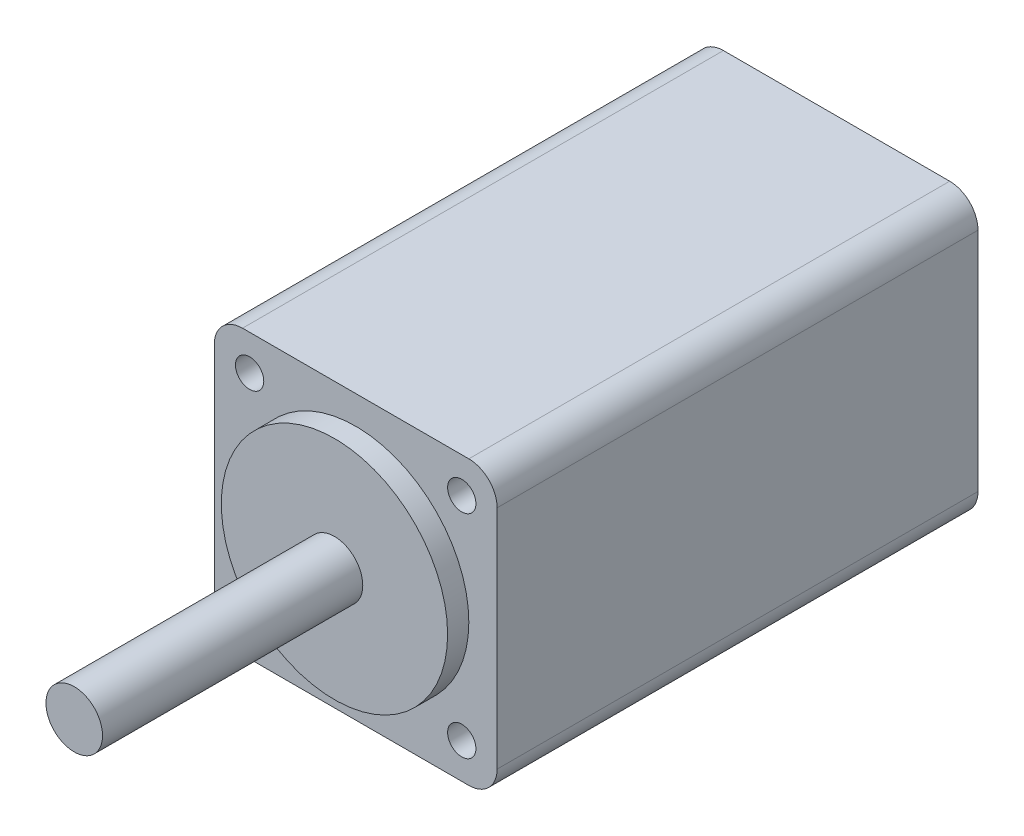
ISO-10303-21;
HEADER;
FILE_DESCRIPTION(('STEP AP214'),'2;1');
FILE_NAME('part.step','',(''),(''),'','','');
FILE_SCHEMA(('AUTOMOTIVE_DESIGN { 1 0 10303 214 1 1 1 1 }'));
ENDSEC;
DATA;
#1=APPLICATION_CONTEXT('core data for automotive mechanical design processes');
#2=APPLICATION_PROTOCOL_DEFINITION('international standard','automotive_design',2000,#1);
#3=PRODUCT_CONTEXT('',#1,'mechanical');
#4=PRODUCT('Part','Part','',(#3));
#5=PRODUCT_RELATED_PRODUCT_CATEGORY('part','',(#4));
#6=PRODUCT_DEFINITION_FORMATION('','',#4);
#7=PRODUCT_DEFINITION_CONTEXT('part definition',#1,'design');
#8=PRODUCT_DEFINITION('design','',#6,#7);
#9=PRODUCT_DEFINITION_SHAPE('','',#8);
#10=(LENGTH_UNIT() NAMED_UNIT(*) SI_UNIT(.MILLI.,.METRE.));
#11=(NAMED_UNIT(*) PLANE_ANGLE_UNIT() SI_UNIT($,.RADIAN.));
#12=(NAMED_UNIT(*) SI_UNIT($,.STERADIAN.) SOLID_ANGLE_UNIT());
#13=UNCERTAINTY_MEASURE_WITH_UNIT(LENGTH_MEASURE(1.E-05),#10,'distance_accuracy_value','');
#14=(GEOMETRIC_REPRESENTATION_CONTEXT(3) GLOBAL_UNCERTAINTY_ASSIGNED_CONTEXT((#13)) GLOBAL_UNIT_ASSIGNED_CONTEXT((#10,
#11,#12)) REPRESENTATION_CONTEXT('',''));
#15=CARTESIAN_POINT('',(0.,0.,0.));
#16=DIRECTION('',(0.,0.,1.));
#17=DIRECTION('',(1.,0.,0.));
#18=AXIS2_PLACEMENT_3D('',#15,#16,#17);
#19=CARTESIAN_POINT('',(-21.1341802782819,10.,34.));
#20=DIRECTION('',(1.,0.,0.));
#21=DIRECTION('',(0.,0.,-1.));
#22=AXIS2_PLACEMENT_3D('',#19,#20,#21);
#23=PLANE('',#22);
#24=DIRECTION('',(0.,-1.,0.));
#25=VECTOR('',#24,1.);
#26=CARTESIAN_POINT('',(-21.1341802782819,10.,0.));
#27=LINE('',#26,#25);
#28=CARTESIAN_POINT('',(-21.1341802782819,8.,0.));
#29=VERTEX_POINT('',#28);
#30=CARTESIAN_POINT('',(-21.1341802782819,-8.,0.));
#31=VERTEX_POINT('',#30);
#32=EDGE_CURVE('E133',#29,#31,#27,.T.);
#33=ORIENTED_EDGE('',*,*,#32,.T.);
#34=DIRECTION('',(0.,0.,-1.));
#35=VECTOR('',#34,1.);
#36=CARTESIAN_POINT('',(-21.1341802782819,-8.,34.));
#37=LINE('',#36,#35);
#38=CARTESIAN_POINT('',(-21.1341802782819,-8.,34.));
#39=VERTEX_POINT('',#38);
#40=EDGE_CURVE('E155',#31,#39,#37,.F.);
#41=ORIENTED_EDGE('',*,*,#40,.T.);
#42=DIRECTION('',(0.,-1.,0.));
#43=VECTOR('',#42,1.);
#44=CARTESIAN_POINT('',(-21.1341802782819,10.,34.));
#45=LINE('',#44,#43);
#46=CARTESIAN_POINT('',(-21.1341802782819,8.,34.));
#47=VERTEX_POINT('',#46);
#48=EDGE_CURVE('E131',#47,#39,#45,.T.);
#49=ORIENTED_EDGE('',*,*,#48,.F.);
#50=DIRECTION('',(0.,0.,-1.));
#51=VECTOR('',#50,1.);
#52=CARTESIAN_POINT('',(-21.1341802782819,8.,34.));
#53=LINE('',#52,#51);
#54=EDGE_CURVE('E152',#47,#29,#53,.T.);
#55=ORIENTED_EDGE('',*,*,#54,.T.);
#56=EDGE_LOOP('',(#33,#41,#49,#55));
#57=FACE_BOUND('',#56,.T.);
#58=ADVANCED_FACE('F36',(#57),#23,.F.);
#59=CARTESIAN_POINT('',(-21.1341802782819,-10.,34.));
#60=DIRECTION('',(0.,1.,0.));
#61=DIRECTION('',(0.,0.,1.));
#62=AXIS2_PLACEMENT_3D('',#59,#60,#61);
#63=PLANE('',#62);
#64=DIRECTION('',(1.,0.,0.));
#65=VECTOR('',#64,1.);
#66=CARTESIAN_POINT('',(-21.1341802782819,-10.,0.));
#67=LINE('',#66,#65);
#68=CARTESIAN_POINT('',(-19.1341802782819,-10.,0.));
#69=VERTEX_POINT('',#68);
#70=CARTESIAN_POINT('',(-3.13418027828189,-10.,0.));
#71=VERTEX_POINT('',#70);
#72=EDGE_CURVE('E129',#69,#71,#67,.T.);
#73=ORIENTED_EDGE('',*,*,#72,.T.);
#74=DIRECTION('',(0.,0.,-1.));
#75=VECTOR('',#74,1.);
#76=CARTESIAN_POINT('',(-3.13418027828189,-10.,34.));
#77=LINE('',#76,#75);
#78=CARTESIAN_POINT('',(-3.13418027828189,-10.,34.));
#79=VERTEX_POINT('',#78);
#80=EDGE_CURVE('E107',#71,#79,#77,.F.);
#81=ORIENTED_EDGE('',*,*,#80,.T.);
#82=DIRECTION('',(1.,0.,0.));
#83=VECTOR('',#82,1.);
#84=CARTESIAN_POINT('',(-21.1341802782819,-10.,34.));
#85=LINE('',#84,#83);
#86=CARTESIAN_POINT('',(-19.1341802782819,-10.,34.));
#87=VERTEX_POINT('',#86);
#88=EDGE_CURVE('E169',#87,#79,#85,.T.);
#89=ORIENTED_EDGE('',*,*,#88,.F.);
#90=DIRECTION('',(0.,0.,-1.));
#91=VECTOR('',#90,1.);
#92=CARTESIAN_POINT('',(-19.1341802782819,-10.,34.));
#93=LINE('',#92,#91);
#94=EDGE_CURVE('E112',#87,#69,#93,.T.);
#95=ORIENTED_EDGE('',*,*,#94,.T.);
#96=EDGE_LOOP('',(#73,#81,#89,#95));
#97=FACE_BOUND('',#96,.T.);
#98=ADVANCED_FACE('F174',(#97),#63,.F.);
#99=CARTESIAN_POINT('',(-1.1341802782819,10.,34.));
#100=DIRECTION('',(-1.,0.,0.));
#101=DIRECTION('',(0.,-1.,0.));
#102=AXIS2_PLACEMENT_3D('',#99,#100,#101);
#103=PLANE('',#102);
#104=DIRECTION('',(0.,1.,0.));
#105=VECTOR('',#104,1.);
#106=CARTESIAN_POINT('',(-1.1341802782819,10.,34.));
#107=LINE('',#106,#105);
#108=CARTESIAN_POINT('',(-1.13418027828189,-8.,34.));
#109=VERTEX_POINT('',#108);
#110=CARTESIAN_POINT('',(-1.1341802782819,8.,34.));
#111=VERTEX_POINT('',#110);
#112=EDGE_CURVE('E121',#109,#111,#107,.T.);
#113=ORIENTED_EDGE('',*,*,#112,.F.);
#114=DIRECTION('',(0.,0.,-1.));
#115=VECTOR('',#114,1.);
#116=CARTESIAN_POINT('',(-1.13418027828189,-8.,34.));
#117=LINE('',#116,#115);
#118=CARTESIAN_POINT('',(-1.13418027828189,-8.,0.));
#119=VERTEX_POINT('',#118);
#120=EDGE_CURVE('E106',#109,#119,#117,.T.);
#121=ORIENTED_EDGE('',*,*,#120,.T.);
#122=DIRECTION('',(0.,1.,0.));
#123=VECTOR('',#122,1.);
#124=CARTESIAN_POINT('',(-1.1341802782819,10.,0.));
#125=LINE('',#124,#123);
#126=CARTESIAN_POINT('',(-1.1341802782819,8.,0.));
#127=VERTEX_POINT('',#126);
#128=EDGE_CURVE('E119',#119,#127,#125,.T.);
#129=ORIENTED_EDGE('',*,*,#128,.T.);
#130=DIRECTION('',(0.,0.,-1.));
#131=VECTOR('',#130,1.);
#132=CARTESIAN_POINT('',(-1.1341802782819,8.,34.));
#133=LINE('',#132,#131);
#134=EDGE_CURVE('E123',#127,#111,#133,.F.);
#135=ORIENTED_EDGE('',*,*,#134,.T.);
#136=EDGE_LOOP('',(#113,#121,#129,#135));
#137=FACE_BOUND('',#136,.T.);
#138=ADVANCED_FACE('F118',(#137),#103,.F.);
#139=CARTESIAN_POINT('',(-21.1341802782819,10.,34.));
#140=DIRECTION('',(0.,-1.,0.));
#141=DIRECTION('',(0.,0.,-1.));
#142=AXIS2_PLACEMENT_3D('',#139,#140,#141);
#143=PLANE('',#142);
#144=DIRECTION('',(-1.,0.,0.));
#145=VECTOR('',#144,1.);
#146=CARTESIAN_POINT('',(-21.1341802782819,10.,34.));
#147=LINE('',#146,#145);
#148=CARTESIAN_POINT('',(-3.13418027828189,10.,34.));
#149=VERTEX_POINT('',#148);
#150=CARTESIAN_POINT('',(-19.1341802782819,10.,34.));
#151=VERTEX_POINT('',#150);
#152=EDGE_CURVE('E137',#149,#151,#147,.T.);
#153=ORIENTED_EDGE('',*,*,#152,.F.);
#154=DIRECTION('',(0.,0.,-1.));
#155=VECTOR('',#154,1.);
#156=CARTESIAN_POINT('',(-3.13418027828189,10.,34.));
#157=LINE('',#156,#155);
#158=CARTESIAN_POINT('',(-3.13418027828189,10.,0.));
#159=VERTEX_POINT('',#158);
#160=EDGE_CURVE('E11',#149,#159,#157,.T.);
#161=ORIENTED_EDGE('',*,*,#160,.T.);
#162=DIRECTION('',(-1.,0.,0.));
#163=VECTOR('',#162,1.);
#164=CARTESIAN_POINT('',(-21.1341802782819,10.,0.));
#165=LINE('',#164,#163);
#166=CARTESIAN_POINT('',(-19.1341802782819,10.,0.));
#167=VERTEX_POINT('',#166);
#168=EDGE_CURVE('E128',#159,#167,#165,.T.);
#169=ORIENTED_EDGE('',*,*,#168,.T.);
#170=DIRECTION('',(0.,0.,-1.));
#171=VECTOR('',#170,1.);
#172=CARTESIAN_POINT('',(-19.1341802782819,10.,34.));
#173=LINE('',#172,#171);
#174=EDGE_CURVE('E44',#167,#151,#173,.F.);
#175=ORIENTED_EDGE('',*,*,#174,.T.);
#176=EDGE_LOOP('',(#153,#161,#169,#175));
#177=FACE_BOUND('',#176,.T.);
#178=ADVANCED_FACE('F239',(#177),#143,.F.);
#179=CARTESIAN_POINT('',(0.,0.,34.));
#180=DIRECTION('',(0.,0.,1.));
#181=DIRECTION('',(1.,0.,0.));
#182=AXIS2_PLACEMENT_3D('',#179,#180,#181);
#183=PLANE('',#182);
#184=CARTESIAN_POINT('',(-18.6341802782819,-7.5,34.));
#185=DIRECTION('',(0.,0.,-1.));
#186=DIRECTION('',(1.,0.,0.));
#187=AXIS2_PLACEMENT_3D('',#184,#185,#186);
#188=CIRCLE('',#187,1.);
#189=CARTESIAN_POINT('',(-17.6341802782819,-7.5,34.));
#190=VERTEX_POINT('',#189);
#191=EDGE_CURVE('E210',#190,#190,#188,.T.);
#192=ORIENTED_EDGE('',*,*,#191,.T.);
#193=EDGE_LOOP('',(#192));
#194=FACE_BOUND('',#193,.T.);
#195=CARTESIAN_POINT('',(-3.63418027828189,-7.5,34.));
#196=DIRECTION('',(0.,0.,1.));
#197=DIRECTION('',(-1.,0.,0.));
#198=AXIS2_PLACEMENT_3D('',#195,#196,#197);
#199=CIRCLE('',#198,1.);
#200=CARTESIAN_POINT('',(-4.6341802782819,-7.5,34.));
#201=VERTEX_POINT('',#200);
#202=EDGE_CURVE('E204',#201,#201,#199,.T.);
#203=ORIENTED_EDGE('',*,*,#202,.F.);
#204=EDGE_LOOP('',(#203));
#205=FACE_BOUND('',#204,.T.);
#206=CARTESIAN_POINT('',(-3.63418027828189,7.5,34.));
#207=DIRECTION('',(0.,0.,-1.));
#208=DIRECTION('',(-1.,0.,0.));
#209=AXIS2_PLACEMENT_3D('',#206,#207,#208);
#210=CIRCLE('',#209,1.);
#211=CARTESIAN_POINT('',(-4.6341802782819,7.5,34.));
#212=VERTEX_POINT('',#211);
#213=EDGE_CURVE('E198',#212,#212,#210,.T.);
#214=ORIENTED_EDGE('',*,*,#213,.T.);
#215=EDGE_LOOP('',(#214));
#216=FACE_BOUND('',#215,.T.);
#217=CARTESIAN_POINT('',(-18.6341802782819,7.5,34.));
#218=DIRECTION('',(0.,0.,1.));
#219=DIRECTION('',(1.,0.,0.));
#220=AXIS2_PLACEMENT_3D('',#217,#218,#219);
#221=CIRCLE('',#220,1.);
#222=CARTESIAN_POINT('',(-17.6341802782819,7.5,34.));
#223=VERTEX_POINT('',#222);
#224=EDGE_CURVE('E192',#223,#223,#221,.T.);
#225=ORIENTED_EDGE('',*,*,#224,.F.);
#226=EDGE_LOOP('',(#225));
#227=FACE_BOUND('',#226,.T.);
#228=CARTESIAN_POINT('',(-11.1341802782819,0.,34.));
#229=DIRECTION('',(0.,0.,1.));
#230=DIRECTION('',(1.,0.,0.));
#231=AXIS2_PLACEMENT_3D('',#228,#229,#230);
#232=CIRCLE('',#231,8.);
#233=CARTESIAN_POINT('',(-3.13418027828189,0.,34.));
#234=VERTEX_POINT('',#233);
#235=EDGE_CURVE('E177',#234,#234,#232,.T.);
#236=ORIENTED_EDGE('',*,*,#235,.F.);
#237=EDGE_LOOP('',(#236));
#238=FACE_BOUND('',#237,.T.);
#239=ORIENTED_EDGE('',*,*,#88,.T.);
#240=CARTESIAN_POINT('',(-3.13418027828189,-8.,34.));
#241=DIRECTION('',(0.,0.,1.));
#242=DIRECTION('',(1.,0.,0.));
#243=AXIS2_PLACEMENT_3D('',#240,#241,#242);
#244=CIRCLE('',#243,2.);
#245=EDGE_CURVE('E150',#79,#109,#244,.T.);
#246=ORIENTED_EDGE('',*,*,#245,.T.);
#247=ORIENTED_EDGE('',*,*,#112,.T.);
#248=CARTESIAN_POINT('',(-3.13418027828189,8.,34.));
#249=DIRECTION('',(0.,0.,1.));
#250=DIRECTION('',(1.,0.,0.));
#251=AXIS2_PLACEMENT_3D('',#248,#249,#250);
#252=CIRCLE('',#251,2.);
#253=EDGE_CURVE('E57',#111,#149,#252,.T.);
#254=ORIENTED_EDGE('',*,*,#253,.T.);
#255=ORIENTED_EDGE('',*,*,#152,.T.);
#256=CARTESIAN_POINT('',(-19.1341802782819,8.,34.));
#257=DIRECTION('',(0.,0.,1.));
#258=DIRECTION('',(1.,0.,0.));
#259=AXIS2_PLACEMENT_3D('',#256,#257,#258);
#260=CIRCLE('',#259,2.);
#261=EDGE_CURVE('E145',#151,#47,#260,.T.);
#262=ORIENTED_EDGE('',*,*,#261,.T.);
#263=ORIENTED_EDGE('',*,*,#48,.T.);
#264=CARTESIAN_POINT('',(-19.1341802782819,-8.,34.));
#265=DIRECTION('',(0.,0.,1.));
#266=DIRECTION('',(1.,0.,0.));
#267=AXIS2_PLACEMENT_3D('',#264,#265,#266);
#268=CIRCLE('',#267,2.);
#269=EDGE_CURVE('E148',#39,#87,#268,.T.);
#270=ORIENTED_EDGE('',*,*,#269,.T.);
#271=EDGE_LOOP('',(#239,#246,#247,#254,#255,#262,#263,#270));
#272=FACE_BOUND('',#271,.T.);
#273=ADVANCED_FACE('F166',(#194,#205,#216,#227,#238,#272),#183,.T.);
#274=CARTESIAN_POINT('',(0.,0.,0.));
#275=DIRECTION('',(0.,0.,1.));
#276=DIRECTION('',(1.,0.,0.));
#277=AXIS2_PLACEMENT_3D('',#274,#275,#276);
#278=PLANE('',#277);
#279=CARTESIAN_POINT('',(-18.6341802782819,-7.5,0.));
#280=DIRECTION('',(0.,0.,-1.));
#281=DIRECTION('',(1.,0.,0.));
#282=AXIS2_PLACEMENT_3D('',#279,#280,#281);
#283=CIRCLE('',#282,1.);
#284=CARTESIAN_POINT('',(-17.6341802782819,-7.5,0.));
#285=VERTEX_POINT('',#284);
#286=EDGE_CURVE('E207',#285,#285,#283,.T.);
#287=ORIENTED_EDGE('',*,*,#286,.F.);
#288=EDGE_LOOP('',(#287));
#289=FACE_BOUND('',#288,.T.);
#290=CARTESIAN_POINT('',(-3.63418027828189,-7.5,0.));
#291=DIRECTION('',(0.,0.,1.));
#292=DIRECTION('',(-1.,0.,0.));
#293=AXIS2_PLACEMENT_3D('',#290,#291,#292);
#294=CIRCLE('',#293,1.);
#295=CARTESIAN_POINT('',(-4.6341802782819,-7.5,0.));
#296=VERTEX_POINT('',#295);
#297=EDGE_CURVE('E201',#296,#296,#294,.T.);
#298=ORIENTED_EDGE('',*,*,#297,.T.);
#299=EDGE_LOOP('',(#298));
#300=FACE_BOUND('',#299,.T.);
#301=CARTESIAN_POINT('',(-3.63418027828189,7.5,0.));
#302=DIRECTION('',(0.,0.,-1.));
#303=DIRECTION('',(-1.,0.,0.));
#304=AXIS2_PLACEMENT_3D('',#301,#302,#303);
#305=CIRCLE('',#304,1.);
#306=CARTESIAN_POINT('',(-4.6341802782819,7.5,0.));
#307=VERTEX_POINT('',#306);
#308=EDGE_CURVE('E195',#307,#307,#305,.T.);
#309=ORIENTED_EDGE('',*,*,#308,.F.);
#310=EDGE_LOOP('',(#309));
#311=FACE_BOUND('',#310,.T.);
#312=CARTESIAN_POINT('',(-18.6341802782819,7.5,0.));
#313=DIRECTION('',(0.,0.,1.));
#314=DIRECTION('',(1.,0.,0.));
#315=AXIS2_PLACEMENT_3D('',#312,#313,#314);
#316=CIRCLE('',#315,1.);
#317=CARTESIAN_POINT('',(-17.6341802782819,7.5,0.));
#318=VERTEX_POINT('',#317);
#319=EDGE_CURVE('E189',#318,#318,#316,.T.);
#320=ORIENTED_EDGE('',*,*,#319,.T.);
#321=EDGE_LOOP('',(#320));
#322=FACE_BOUND('',#321,.T.);
#323=ORIENTED_EDGE('',*,*,#128,.F.);
#324=CARTESIAN_POINT('',(-3.13418027828189,-8.,0.));
#325=DIRECTION('',(0.,0.,1.));
#326=DIRECTION('',(1.,0.,0.));
#327=AXIS2_PLACEMENT_3D('',#324,#325,#326);
#328=CIRCLE('',#327,2.);
#329=EDGE_CURVE('E102',#119,#71,#328,.F.);
#330=ORIENTED_EDGE('',*,*,#329,.T.);
#331=ORIENTED_EDGE('',*,*,#72,.F.);
#332=CARTESIAN_POINT('',(-19.1341802782819,-8.,0.));
#333=DIRECTION('',(0.,0.,1.));
#334=DIRECTION('',(1.,0.,0.));
#335=AXIS2_PLACEMENT_3D('',#332,#333,#334);
#336=CIRCLE('',#335,2.);
#337=EDGE_CURVE('E113',#69,#31,#336,.F.);
#338=ORIENTED_EDGE('',*,*,#337,.T.);
#339=ORIENTED_EDGE('',*,*,#32,.F.);
#340=CARTESIAN_POINT('',(-19.1341802782819,8.,0.));
#341=DIRECTION('',(0.,0.,1.));
#342=DIRECTION('',(1.,0.,0.));
#343=AXIS2_PLACEMENT_3D('',#340,#341,#342);
#344=CIRCLE('',#343,2.);
#345=EDGE_CURVE('E122',#29,#167,#344,.F.);
#346=ORIENTED_EDGE('',*,*,#345,.T.);
#347=ORIENTED_EDGE('',*,*,#168,.F.);
#348=CARTESIAN_POINT('',(-3.13418027828189,8.,0.));
#349=DIRECTION('',(0.,0.,1.));
#350=DIRECTION('',(1.,0.,0.));
#351=AXIS2_PLACEMENT_3D('',#348,#349,#350);
#352=CIRCLE('',#351,2.);
#353=EDGE_CURVE('E127',#159,#127,#352,.F.);
#354=ORIENTED_EDGE('',*,*,#353,.T.);
#355=EDGE_LOOP('',(#323,#330,#331,#338,#339,#346,#347,#354));
#356=FACE_BOUND('',#355,.T.);
#357=ADVANCED_FACE('F125',(#289,#300,#311,#322,#356),#278,.F.);
#358=CARTESIAN_POINT('',(-11.1341802782819,0.,35.5));
#359=DIRECTION('',(0.,0.,-1.));
#360=DIRECTION('',(-1.,0.,0.));
#361=AXIS2_PLACEMENT_3D('',#358,#359,#360);
#362=CYLINDRICAL_SURFACE('',#361,8.);
#363=CARTESIAN_POINT('',(-11.1341802782819,0.,35.5));
#364=DIRECTION('',(0.,0.,1.));
#365=DIRECTION('',(1.,0.,0.));
#366=AXIS2_PLACEMENT_3D('',#363,#364,#365);
#367=CIRCLE('',#366,8.);
#368=CARTESIAN_POINT('',(-3.13418027828189,0.,35.5));
#369=VERTEX_POINT('',#368);
#370=EDGE_CURVE('E175',#369,#369,#367,.T.);
#371=ORIENTED_EDGE('',*,*,#370,.F.);
#372=EDGE_LOOP('',(#371));
#373=FACE_BOUND('',#372,.T.);
#374=ORIENTED_EDGE('',*,*,#235,.T.);
#375=EDGE_LOOP('',(#374));
#376=FACE_BOUND('',#375,.T.);
#377=ADVANCED_FACE('F221',(#373,#376),#362,.T.);
#378=CARTESIAN_POINT('',(-11.1341802782819,0.,35.5));
#379=DIRECTION('',(0.,0.,1.));
#380=DIRECTION('',(1.,0.,0.));
#381=AXIS2_PLACEMENT_3D('',#378,#379,#380);
#382=PLANE('',#381);
#383=CARTESIAN_POINT('',(-11.1341802782819,0.,35.5));
#384=DIRECTION('',(0.,0.,1.));
#385=DIRECTION('',(1.,0.,0.));
#386=AXIS2_PLACEMENT_3D('',#383,#384,#385);
#387=CIRCLE('',#386,2.);
#388=CARTESIAN_POINT('',(-9.13418027828189,0.,35.5));
#389=VERTEX_POINT('',#388);
#390=EDGE_CURVE('E186',#389,#389,#387,.T.);
#391=ORIENTED_EDGE('',*,*,#390,.F.);
#392=EDGE_LOOP('',(#391));
#393=FACE_BOUND('',#392,.T.);
#394=ORIENTED_EDGE('',*,*,#370,.T.);
#395=EDGE_LOOP('',(#394));
#396=FACE_BOUND('',#395,.T.);
#397=ADVANCED_FACE('F245',(#393,#396),#382,.T.);
#398=CARTESIAN_POINT('',(-11.1341802782819,0.,53.9));
#399=DIRECTION('',(0.,0.,-1.));
#400=DIRECTION('',(-1.,0.,0.));
#401=AXIS2_PLACEMENT_3D('',#398,#399,#400);
#402=CYLINDRICAL_SURFACE('',#401,2.);
#403=CARTESIAN_POINT('',(-11.1341802782819,0.,53.9));
#404=DIRECTION('',(0.,0.,1.));
#405=DIRECTION('',(1.,0.,0.));
#406=AXIS2_PLACEMENT_3D('',#403,#404,#405);
#407=CIRCLE('',#406,2.);
#408=CARTESIAN_POINT('',(-9.13418027828189,0.,53.9));
#409=VERTEX_POINT('',#408);
#410=EDGE_CURVE('E184',#409,#409,#407,.T.);
#411=ORIENTED_EDGE('',*,*,#410,.F.);
#412=EDGE_LOOP('',(#411));
#413=FACE_BOUND('',#412,.T.);
#414=ORIENTED_EDGE('',*,*,#390,.T.);
#415=EDGE_LOOP('',(#414));
#416=FACE_BOUND('',#415,.T.);
#417=ADVANCED_FACE('F253',(#413,#416),#402,.T.);
#418=CARTESIAN_POINT('',(-11.1341802782819,0.,53.9));
#419=DIRECTION('',(0.,0.,1.));
#420=DIRECTION('',(1.,0.,0.));
#421=AXIS2_PLACEMENT_3D('',#418,#419,#420);
#422=PLANE('',#421);
#423=ORIENTED_EDGE('',*,*,#410,.T.);
#424=EDGE_LOOP('',(#423));
#425=FACE_BOUND('',#424,.T.);
#426=ADVANCED_FACE('F233',(#425),#422,.T.);
#427=CARTESIAN_POINT('',(-18.6341802782819,7.5,0.));
#428=DIRECTION('',(0.,0.,1.));
#429=DIRECTION('',(1.,0.,0.));
#430=AXIS2_PLACEMENT_3D('',#427,#428,#429);
#431=CYLINDRICAL_SURFACE('',#430,1.);
#432=ORIENTED_EDGE('',*,*,#319,.F.);
#433=EDGE_LOOP('',(#432));
#434=FACE_BOUND('',#433,.T.);
#435=ORIENTED_EDGE('',*,*,#224,.T.);
#436=EDGE_LOOP('',(#435));
#437=FACE_BOUND('',#436,.T.);
#438=ADVANCED_FACE('F229',(#434,#437),#431,.F.);
#439=CARTESIAN_POINT('',(-3.63418027828189,7.5,0.));
#440=DIRECTION('',(0.,0.,1.));
#441=DIRECTION('',(1.,0.,0.));
#442=AXIS2_PLACEMENT_3D('',#439,#440,#441);
#443=CYLINDRICAL_SURFACE('',#442,1.);
#444=ORIENTED_EDGE('',*,*,#308,.T.);
#445=EDGE_LOOP('',(#444));
#446=FACE_BOUND('',#445,.T.);
#447=ORIENTED_EDGE('',*,*,#213,.F.);
#448=EDGE_LOOP('',(#447));
#449=FACE_BOUND('',#448,.T.);
#450=ADVANCED_FACE('F232',(#446,#449),#443,.F.);
#451=CARTESIAN_POINT('',(-3.63418027828189,-7.5,0.));
#452=DIRECTION('',(0.,0.,1.));
#453=DIRECTION('',(1.,0.,0.));
#454=AXIS2_PLACEMENT_3D('',#451,#452,#453);
#455=CYLINDRICAL_SURFACE('',#454,1.);
#456=ORIENTED_EDGE('',*,*,#297,.F.);
#457=EDGE_LOOP('',(#456));
#458=FACE_BOUND('',#457,.T.);
#459=ORIENTED_EDGE('',*,*,#202,.T.);
#460=EDGE_LOOP('',(#459));
#461=FACE_BOUND('',#460,.T.);
#462=ADVANCED_FACE('F347',(#458,#461),#455,.F.);
#463=CARTESIAN_POINT('',(-18.6341802782819,-7.5,0.));
#464=DIRECTION('',(0.,0.,1.));
#465=DIRECTION('',(1.,0.,0.));
#466=AXIS2_PLACEMENT_3D('',#463,#464,#465);
#467=CYLINDRICAL_SURFACE('',#466,1.);
#468=ORIENTED_EDGE('',*,*,#286,.T.);
#469=EDGE_LOOP('',(#468));
#470=FACE_BOUND('',#469,.T.);
#471=ORIENTED_EDGE('',*,*,#191,.F.);
#472=EDGE_LOOP('',(#471));
#473=FACE_BOUND('',#472,.T.);
#474=ADVANCED_FACE('F216',(#470,#473),#467,.F.);
#475=CARTESIAN_POINT('',(-3.13418027828189,-8.,34.));
#476=DIRECTION('',(0.,0.,-1.));
#477=DIRECTION('',(-1.,0.,0.));
#478=AXIS2_PLACEMENT_3D('',#475,#476,#477);
#479=CYLINDRICAL_SURFACE('',#478,2.);
#480=ORIENTED_EDGE('',*,*,#245,.F.);
#481=ORIENTED_EDGE('',*,*,#80,.F.);
#482=ORIENTED_EDGE('',*,*,#329,.F.);
#483=ORIENTED_EDGE('',*,*,#120,.F.);
#484=EDGE_LOOP('',(#480,#481,#482,#483));
#485=FACE_BOUND('',#484,.T.);
#486=ADVANCED_FACE('F105',(#485),#479,.T.);
#487=CARTESIAN_POINT('',(-19.1341802782819,-8.,34.));
#488=DIRECTION('',(0.,0.,-1.));
#489=DIRECTION('',(-1.,0.,0.));
#490=AXIS2_PLACEMENT_3D('',#487,#488,#489);
#491=CYLINDRICAL_SURFACE('',#490,2.);
#492=ORIENTED_EDGE('',*,*,#269,.F.);
#493=ORIENTED_EDGE('',*,*,#40,.F.);
#494=ORIENTED_EDGE('',*,*,#337,.F.);
#495=ORIENTED_EDGE('',*,*,#94,.F.);
#496=EDGE_LOOP('',(#492,#493,#494,#495));
#497=FACE_BOUND('',#496,.T.);
#498=ADVANCED_FACE('F172',(#497),#491,.T.);
#499=CARTESIAN_POINT('',(-3.13418027828189,8.,34.));
#500=DIRECTION('',(0.,0.,-1.));
#501=DIRECTION('',(-1.,0.,0.));
#502=AXIS2_PLACEMENT_3D('',#499,#500,#501);
#503=CYLINDRICAL_SURFACE('',#502,2.);
#504=ORIENTED_EDGE('',*,*,#253,.F.);
#505=ORIENTED_EDGE('',*,*,#134,.F.);
#506=ORIENTED_EDGE('',*,*,#353,.F.);
#507=ORIENTED_EDGE('',*,*,#160,.F.);
#508=EDGE_LOOP('',(#504,#505,#506,#507));
#509=FACE_BOUND('',#508,.T.);
#510=ADVANCED_FACE('F269',(#509),#503,.T.);
#511=CARTESIAN_POINT('',(-19.1341802782819,8.,34.));
#512=DIRECTION('',(0.,0.,-1.));
#513=DIRECTION('',(-1.,0.,0.));
#514=AXIS2_PLACEMENT_3D('',#511,#512,#513);
#515=CYLINDRICAL_SURFACE('',#514,2.);
#516=ORIENTED_EDGE('',*,*,#261,.F.);
#517=ORIENTED_EDGE('',*,*,#174,.F.);
#518=ORIENTED_EDGE('',*,*,#345,.F.);
#519=ORIENTED_EDGE('',*,*,#54,.F.);
#520=EDGE_LOOP('',(#516,#517,#518,#519));
#521=FACE_BOUND('',#520,.T.);
#522=ADVANCED_FACE('F38',(#521),#515,.T.);
#523=CLOSED_SHELL('',(#58,#98,#138,#178,#273,#357,#377,#397,#417,#426,#438,#450,#462,#474,#486,
#498,#510,#522));
#524=MANIFOLD_SOLID_BREP('B2',#523);
#525=ADVANCED_BREP_SHAPE_REPRESENTATION('',(#18,#524),#14);
#526=SHAPE_DEFINITION_REPRESENTATION(#9,#525);
ENDSEC;
END-ISO-10303-21;
